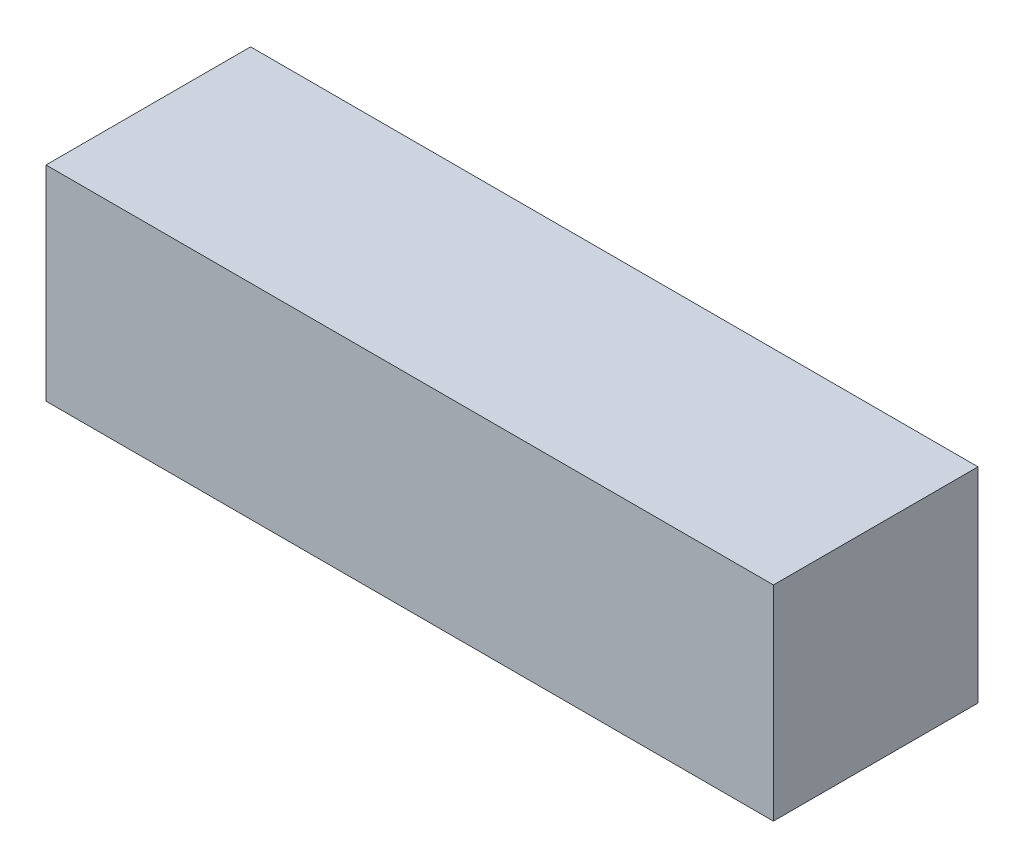
ISO-10303-21;
HEADER;
FILE_DESCRIPTION(('STEP AP214'),'2;1');
FILE_NAME('part.step','',(''),(''),'','','');
FILE_SCHEMA(('AUTOMOTIVE_DESIGN { 1 0 10303 214 1 1 1 1 }'));
ENDSEC;
DATA;
#1=APPLICATION_CONTEXT('core data for automotive mechanical design processes');
#2=APPLICATION_PROTOCOL_DEFINITION('international standard','automotive_design',2000,#1);
#3=PRODUCT_CONTEXT('',#1,'mechanical');
#4=PRODUCT('Part','Part','',(#3));
#5=PRODUCT_RELATED_PRODUCT_CATEGORY('part','',(#4));
#6=PRODUCT_DEFINITION_FORMATION('','',#4);
#7=PRODUCT_DEFINITION_CONTEXT('part definition',#1,'design');
#8=PRODUCT_DEFINITION('design','',#6,#7);
#9=PRODUCT_DEFINITION_SHAPE('','',#8);
#10=(LENGTH_UNIT() NAMED_UNIT(*) SI_UNIT(.MILLI.,.METRE.));
#11=(NAMED_UNIT(*) PLANE_ANGLE_UNIT() SI_UNIT($,.RADIAN.));
#12=(NAMED_UNIT(*) SI_UNIT($,.STERADIAN.) SOLID_ANGLE_UNIT());
#13=UNCERTAINTY_MEASURE_WITH_UNIT(LENGTH_MEASURE(1.E-05),#10,'distance_accuracy_value','');
#14=(GEOMETRIC_REPRESENTATION_CONTEXT(3) GLOBAL_UNCERTAINTY_ASSIGNED_CONTEXT((#13)) GLOBAL_UNIT_ASSIGNED_CONTEXT((#10,
#11,#12)) REPRESENTATION_CONTEXT('',''));
#15=CARTESIAN_POINT('',(0.,0.,0.));
#16=DIRECTION('',(0.,0.,1.));
#17=DIRECTION('',(1.,0.,0.));
#18=AXIS2_PLACEMENT_3D('',#15,#16,#17);
#19=CARTESIAN_POINT('',(80.,-22.5,45.));
#20=DIRECTION('',(-1.,0.,0.));
#21=DIRECTION('',(0.,0.,1.));
#22=AXIS2_PLACEMENT_3D('',#19,#20,#21);
#23=PLANE('',#22);
#24=DIRECTION('',(0.,1.,0.));
#25=VECTOR('',#24,1.);
#26=CARTESIAN_POINT('',(80.,-22.5,0.));
#27=LINE('',#26,#25);
#28=CARTESIAN_POINT('',(80.,-22.5,0.));
#29=VERTEX_POINT('',#28);
#30=CARTESIAN_POINT('',(80.,22.5,0.));
#31=VERTEX_POINT('',#30);
#32=EDGE_CURVE('E113',#29,#31,#27,.T.);
#33=ORIENTED_EDGE('',*,*,#32,.T.);
#34=DIRECTION('',(0.,0.,-1.));
#35=VECTOR('',#34,1.);
#36=CARTESIAN_POINT('',(80.,22.5,45.));
#37=LINE('',#36,#35);
#38=CARTESIAN_POINT('',(80.,22.5,45.));
#39=VERTEX_POINT('',#38);
#40=EDGE_CURVE('E11',#39,#31,#37,.T.);
#41=ORIENTED_EDGE('',*,*,#40,.F.);
#42=DIRECTION('',(0.,1.,0.));
#43=VECTOR('',#42,1.);
#44=CARTESIAN_POINT('',(80.,-22.5,45.));
#45=LINE('',#44,#43);
#46=CARTESIAN_POINT('',(80.,-22.5,45.));
#47=VERTEX_POINT('',#46);
#48=EDGE_CURVE('E97',#47,#39,#45,.T.);
#49=ORIENTED_EDGE('',*,*,#48,.F.);
#50=DIRECTION('',(0.,0.,-1.));
#51=VECTOR('',#50,1.);
#52=CARTESIAN_POINT('',(80.,-22.5,45.));
#53=LINE('',#52,#51);
#54=EDGE_CURVE('E109',#47,#29,#53,.T.);
#55=ORIENTED_EDGE('',*,*,#54,.T.);
#56=EDGE_LOOP('',(#33,#41,#49,#55));
#57=FACE_BOUND('',#56,.T.);
#58=ADVANCED_FACE('F45',(#57),#23,.F.);
#59=CARTESIAN_POINT('',(-80.,22.5,45.));
#60=DIRECTION('',(0.,-1.,0.));
#61=DIRECTION('',(0.,0.,-1.));
#62=AXIS2_PLACEMENT_3D('',#59,#60,#61);
#63=PLANE('',#62);
#64=DIRECTION('',(-1.,0.,0.));
#65=VECTOR('',#64,1.);
#66=CARTESIAN_POINT('',(-80.,22.5,0.));
#67=LINE('',#66,#65);
#68=CARTESIAN_POINT('',(-80.,22.5,0.));
#69=VERTEX_POINT('',#68);
#70=EDGE_CURVE('E102',#31,#69,#67,.T.);
#71=ORIENTED_EDGE('',*,*,#70,.T.);
#72=DIRECTION('',(0.,0.,-1.));
#73=VECTOR('',#72,1.);
#74=CARTESIAN_POINT('',(-80.,22.5,45.));
#75=LINE('',#74,#73);
#76=CARTESIAN_POINT('',(-80.,22.5,45.));
#77=VERTEX_POINT('',#76);
#78=EDGE_CURVE('E54',#77,#69,#75,.T.);
#79=ORIENTED_EDGE('',*,*,#78,.F.);
#80=DIRECTION('',(-1.,0.,0.));
#81=VECTOR('',#80,1.);
#82=CARTESIAN_POINT('',(-80.,22.5,45.));
#83=LINE('',#82,#81);
#84=EDGE_CURVE('E92',#39,#77,#83,.T.);
#85=ORIENTED_EDGE('',*,*,#84,.F.);
#86=ORIENTED_EDGE('',*,*,#40,.T.);
#87=EDGE_LOOP('',(#71,#79,#85,#86));
#88=FACE_BOUND('',#87,.T.);
#89=ADVANCED_FACE('F101',(#88),#63,.F.);
#90=CARTESIAN_POINT('',(-80.,-22.5,45.));
#91=DIRECTION('',(1.,0.,0.));
#92=DIRECTION('',(0.,0.,-1.));
#93=AXIS2_PLACEMENT_3D('',#90,#91,#92);
#94=PLANE('',#93);
#95=DIRECTION('',(0.,-1.,0.));
#96=VECTOR('',#95,1.);
#97=CARTESIAN_POINT('',(-80.,-22.5,0.));
#98=LINE('',#97,#96);
#99=CARTESIAN_POINT('',(-80.,-22.5,0.));
#100=VERTEX_POINT('',#99);
#101=EDGE_CURVE('E79',#69,#100,#98,.T.);
#102=ORIENTED_EDGE('',*,*,#101,.T.);
#103=DIRECTION('',(0.,0.,-1.));
#104=VECTOR('',#103,1.);
#105=CARTESIAN_POINT('',(-80.,-22.5,45.));
#106=LINE('',#105,#104);
#107=CARTESIAN_POINT('',(-80.,-22.5,45.));
#108=VERTEX_POINT('',#107);
#109=EDGE_CURVE('E104',#108,#100,#106,.T.);
#110=ORIENTED_EDGE('',*,*,#109,.F.);
#111=DIRECTION('',(0.,-1.,0.));
#112=VECTOR('',#111,1.);
#113=CARTESIAN_POINT('',(-80.,-22.5,45.));
#114=LINE('',#113,#112);
#115=EDGE_CURVE('E95',#77,#108,#114,.T.);
#116=ORIENTED_EDGE('',*,*,#115,.F.);
#117=ORIENTED_EDGE('',*,*,#78,.T.);
#118=EDGE_LOOP('',(#102,#110,#116,#117));
#119=FACE_BOUND('',#118,.T.);
#120=ADVANCED_FACE('F105',(#119),#94,.F.);
#121=CARTESIAN_POINT('',(-80.,-22.5,45.));
#122=DIRECTION('',(0.,1.,0.));
#123=DIRECTION('',(0.,0.,1.));
#124=AXIS2_PLACEMENT_3D('',#121,#122,#123);
#125=PLANE('',#124);
#126=DIRECTION('',(1.,0.,0.));
#127=VECTOR('',#126,1.);
#128=CARTESIAN_POINT('',(-80.,-22.5,0.));
#129=LINE('',#128,#127);
#130=EDGE_CURVE('E85',#100,#29,#129,.T.);
#131=ORIENTED_EDGE('',*,*,#130,.T.);
#132=ORIENTED_EDGE('',*,*,#54,.F.);
#133=DIRECTION('',(1.,0.,0.));
#134=VECTOR('',#133,1.);
#135=CARTESIAN_POINT('',(-80.,-22.5,45.));
#136=LINE('',#135,#134);
#137=EDGE_CURVE('E62',#108,#47,#136,.T.);
#138=ORIENTED_EDGE('',*,*,#137,.F.);
#139=ORIENTED_EDGE('',*,*,#109,.T.);
#140=EDGE_LOOP('',(#131,#132,#138,#139));
#141=FACE_BOUND('',#140,.T.);
#142=ADVANCED_FACE('F126',(#141),#125,.F.);
#143=CARTESIAN_POINT('',(0.,0.,45.));
#144=DIRECTION('',(0.,0.,-1.));
#145=DIRECTION('',(-1.,0.,0.));
#146=AXIS2_PLACEMENT_3D('',#143,#144,#145);
#147=PLANE('',#146);
#148=ORIENTED_EDGE('',*,*,#48,.T.);
#149=ORIENTED_EDGE('',*,*,#84,.T.);
#150=ORIENTED_EDGE('',*,*,#115,.T.);
#151=ORIENTED_EDGE('',*,*,#137,.T.);
#152=EDGE_LOOP('',(#148,#149,#150,#151));
#153=FACE_BOUND('',#152,.T.);
#154=ADVANCED_FACE('F93',(#153),#147,.F.);
#155=CARTESIAN_POINT('',(0.,0.,0.));
#156=DIRECTION('',(0.,0.,-1.));
#157=DIRECTION('',(-1.,0.,0.));
#158=AXIS2_PLACEMENT_3D('',#155,#156,#157);
#159=PLANE('',#158);
#160=ORIENTED_EDGE('',*,*,#32,.F.);
#161=ORIENTED_EDGE('',*,*,#130,.F.);
#162=ORIENTED_EDGE('',*,*,#101,.F.);
#163=ORIENTED_EDGE('',*,*,#70,.F.);
#164=EDGE_LOOP('',(#160,#161,#162,#163));
#165=FACE_BOUND('',#164,.T.);
#166=ADVANCED_FACE('F129',(#165),#159,.T.);
#167=CLOSED_SHELL('',(#58,#89,#120,#142,#154,#166));
#168=MANIFOLD_SOLID_BREP('B2',#167);
#169=ADVANCED_BREP_SHAPE_REPRESENTATION('',(#18,#168),#14);
#170=SHAPE_DEFINITION_REPRESENTATION(#9,#169);
ENDSEC;
END-ISO-10303-21;
